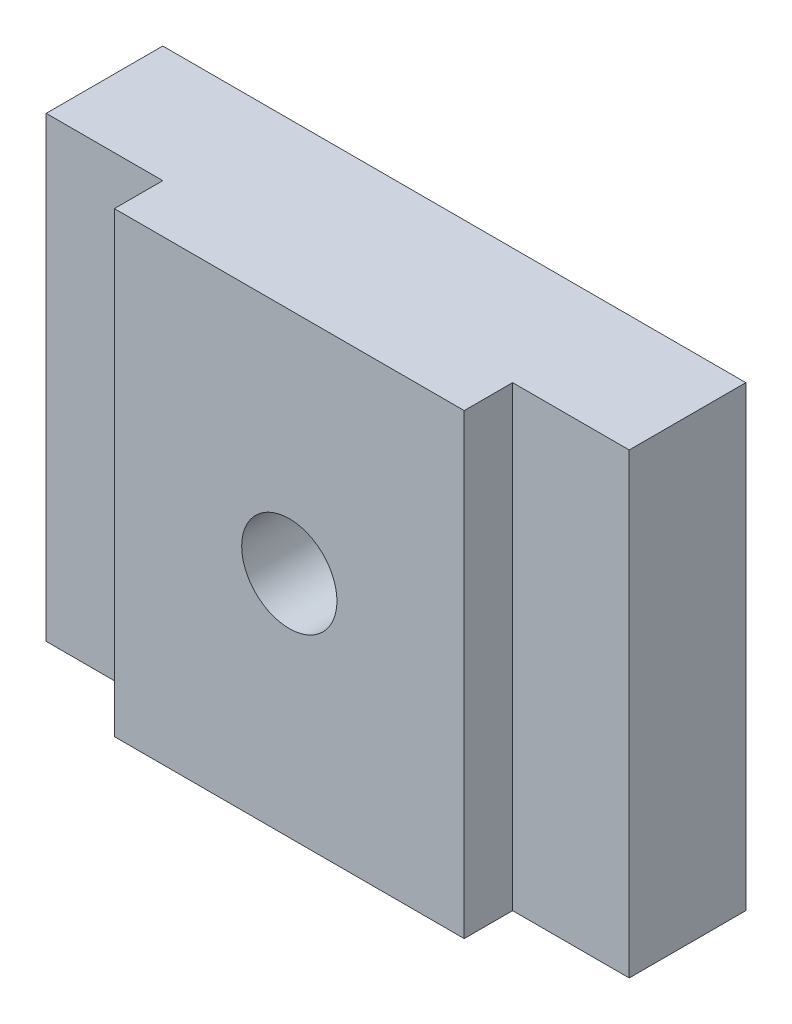
ISO-10303-21;
HEADER;
FILE_DESCRIPTION(('STEP AP214'),'2;1');
FILE_NAME('part.step','',(''),(''),'','','');
FILE_SCHEMA(('AUTOMOTIVE_DESIGN { 1 0 10303 214 1 1 1 1 }'));
ENDSEC;
DATA;
#1=APPLICATION_CONTEXT('core data for automotive mechanical design processes');
#2=APPLICATION_PROTOCOL_DEFINITION('international standard','automotive_design',2000,#1);
#3=PRODUCT_CONTEXT('',#1,'mechanical');
#4=PRODUCT('Part','Part','',(#3));
#5=PRODUCT_RELATED_PRODUCT_CATEGORY('part','',(#4));
#6=PRODUCT_DEFINITION_FORMATION('','',#4);
#7=PRODUCT_DEFINITION_CONTEXT('part definition',#1,'design');
#8=PRODUCT_DEFINITION('design','',#6,#7);
#9=PRODUCT_DEFINITION_SHAPE('','',#8);
#10=(LENGTH_UNIT() NAMED_UNIT(*) SI_UNIT(.MILLI.,.METRE.));
#11=(NAMED_UNIT(*) PLANE_ANGLE_UNIT() SI_UNIT($,.RADIAN.));
#12=(NAMED_UNIT(*) SI_UNIT($,.STERADIAN.) SOLID_ANGLE_UNIT());
#13=UNCERTAINTY_MEASURE_WITH_UNIT(LENGTH_MEASURE(1.E-05),#10,'distance_accuracy_value','');
#14=(GEOMETRIC_REPRESENTATION_CONTEXT(3) GLOBAL_UNCERTAINTY_ASSIGNED_CONTEXT((#13)) GLOBAL_UNIT_ASSIGNED_CONTEXT((#10,
#11,#12)) REPRESENTATION_CONTEXT('',''));
#15=CARTESIAN_POINT('',(0.,0.,0.));
#16=DIRECTION('',(0.,0.,1.));
#17=DIRECTION('',(1.,0.,0.));
#18=AXIS2_PLACEMENT_3D('',#15,#16,#17);
#19=CARTESIAN_POINT('',(-7.65,20.,0.));
#20=DIRECTION('',(1.,0.,0.));
#21=DIRECTION('',(0.,0.,-1.));
#22=AXIS2_PLACEMENT_3D('',#19,#20,#21);
#23=PLANE('',#22);
#24=DIRECTION('',(0.,0.,1.));
#25=VECTOR('',#24,1.);
#26=CARTESIAN_POINT('',(-7.65,0.,0.));
#27=LINE('',#26,#25);
#28=CARTESIAN_POINT('',(-7.65,0.,-2.11666666666666));
#29=VERTEX_POINT('',#28);
#30=CARTESIAN_POINT('',(-7.65,0.,0.));
#31=VERTEX_POINT('',#30);
#32=EDGE_CURVE('E128',#29,#31,#27,.T.);
#33=ORIENTED_EDGE('',*,*,#32,.T.);
#34=DIRECTION('',(0.,-1.,0.));
#35=VECTOR('',#34,1.);
#36=CARTESIAN_POINT('',(-7.65,20.,0.));
#37=LINE('',#36,#35);
#38=CARTESIAN_POINT('',(-7.65,20.,0.));
#39=VERTEX_POINT('',#38);
#40=EDGE_CURVE('E11',#39,#31,#37,.T.);
#41=ORIENTED_EDGE('',*,*,#40,.F.);
#42=DIRECTION('',(0.,0.,1.));
#43=VECTOR('',#42,1.);
#44=CARTESIAN_POINT('',(-7.65,20.,0.));
#45=LINE('',#44,#43);
#46=CARTESIAN_POINT('',(-7.65,20.,-2.11666666666666));
#47=VERTEX_POINT('',#46);
#48=EDGE_CURVE('E143',#47,#39,#45,.T.);
#49=ORIENTED_EDGE('',*,*,#48,.F.);
#50=DIRECTION('',(0.,-1.,0.));
#51=VECTOR('',#50,1.);
#52=CARTESIAN_POINT('',(-7.65,20.,-2.11666666666666));
#53=LINE('',#52,#51);
#54=EDGE_CURVE('E124',#47,#29,#53,.T.);
#55=ORIENTED_EDGE('',*,*,#54,.T.);
#56=EDGE_LOOP('',(#33,#41,#49,#55));
#57=FACE_BOUND('',#56,.T.);
#58=ADVANCED_FACE('F32',(#57),#23,.F.);
#59=CARTESIAN_POINT('',(7.65,20.,0.));
#60=DIRECTION('',(0.,0.,-1.));
#61=DIRECTION('',(-1.,0.,0.));
#62=AXIS2_PLACEMENT_3D('',#59,#60,#61);
#63=PLANE('',#62);
#64=CARTESIAN_POINT('',(0.,10.,0.));
#65=DIRECTION('',(0.,0.,-1.));
#66=DIRECTION('',(-1.,0.,0.));
#67=AXIS2_PLACEMENT_3D('',#64,#65,#66);
#68=CIRCLE('',#67,2.0828);
#69=CARTESIAN_POINT('',(-2.0828,10.,0.));
#70=VERTEX_POINT('',#69);
#71=EDGE_CURVE('E132',#70,#70,#68,.T.);
#72=ORIENTED_EDGE('',*,*,#71,.T.);
#73=EDGE_LOOP('',(#72));
#74=FACE_BOUND('',#73,.T.);
#75=DIRECTION('',(1.,0.,0.));
#76=VECTOR('',#75,1.);
#77=CARTESIAN_POINT('',(7.65,0.,0.));
#78=LINE('',#77,#76);
#79=CARTESIAN_POINT('',(7.65,0.,0.));
#80=VERTEX_POINT('',#79);
#81=EDGE_CURVE('E131',#31,#80,#78,.T.);
#82=ORIENTED_EDGE('',*,*,#81,.T.);
#83=DIRECTION('',(0.,-1.,0.));
#84=VECTOR('',#83,1.);
#85=CARTESIAN_POINT('',(7.65,20.,0.));
#86=LINE('',#85,#84);
#87=CARTESIAN_POINT('',(7.65,20.,0.));
#88=VERTEX_POINT('',#87);
#89=EDGE_CURVE('E40',#88,#80,#86,.T.);
#90=ORIENTED_EDGE('',*,*,#89,.F.);
#91=DIRECTION('',(1.,0.,0.));
#92=VECTOR('',#91,1.);
#93=CARTESIAN_POINT('',(7.65,20.,0.));
#94=LINE('',#93,#92);
#95=EDGE_CURVE('E91',#39,#88,#94,.T.);
#96=ORIENTED_EDGE('',*,*,#95,.F.);
#97=ORIENTED_EDGE('',*,*,#40,.T.);
#98=EDGE_LOOP('',(#82,#90,#96,#97));
#99=FACE_BOUND('',#98,.T.);
#100=ADVANCED_FACE('F182',(#74,#99),#63,.F.);
#101=CARTESIAN_POINT('',(7.65,20.,0.));
#102=DIRECTION('',(-1.,0.,0.));
#103=DIRECTION('',(0.,0.,1.));
#104=AXIS2_PLACEMENT_3D('',#101,#102,#103);
#105=PLANE('',#104);
#106=DIRECTION('',(0.,0.,-1.));
#107=VECTOR('',#106,1.);
#108=CARTESIAN_POINT('',(7.65,0.,0.));
#109=LINE('',#108,#107);
#110=CARTESIAN_POINT('',(7.65,0.,-2.11666666666666));
#111=VERTEX_POINT('',#110);
#112=EDGE_CURVE('E134',#80,#111,#109,.T.);
#113=ORIENTED_EDGE('',*,*,#112,.T.);
#114=DIRECTION('',(0.,-1.,0.));
#115=VECTOR('',#114,1.);
#116=CARTESIAN_POINT('',(7.65,20.,-2.11666666666666));
#117=LINE('',#116,#115);
#118=CARTESIAN_POINT('',(7.65,20.,-2.11666666666666));
#119=VERTEX_POINT('',#118);
#120=EDGE_CURVE('E150',#119,#111,#117,.T.);
#121=ORIENTED_EDGE('',*,*,#120,.F.);
#122=DIRECTION('',(0.,0.,-1.));
#123=VECTOR('',#122,1.);
#124=CARTESIAN_POINT('',(7.65,20.,0.));
#125=LINE('',#124,#123);
#126=EDGE_CURVE('E158',#88,#119,#125,.T.);
#127=ORIENTED_EDGE('',*,*,#126,.F.);
#128=ORIENTED_EDGE('',*,*,#89,.T.);
#129=EDGE_LOOP('',(#113,#121,#127,#128));
#130=FACE_BOUND('',#129,.T.);
#131=ADVANCED_FACE('F156',(#130),#105,.F.);
#132=CARTESIAN_POINT('',(7.65,20.,-2.11666666666666));
#133=DIRECTION('',(0.,0.,-1.));
#134=DIRECTION('',(-1.,0.,0.));
#135=AXIS2_PLACEMENT_3D('',#132,#133,#134);
#136=PLANE('',#135);
#137=DIRECTION('',(1.,0.,0.));
#138=VECTOR('',#137,1.);
#139=CARTESIAN_POINT('',(7.65,0.,-2.11666666666666));
#140=LINE('',#139,#138);
#141=CARTESIAN_POINT('',(12.75,0.,-2.11666666666667));
#142=VERTEX_POINT('',#141);
#143=EDGE_CURVE('E136',#111,#142,#140,.T.);
#144=ORIENTED_EDGE('',*,*,#143,.T.);
#145=DIRECTION('',(0.,-1.,0.));
#146=VECTOR('',#145,1.);
#147=CARTESIAN_POINT('',(12.75,20.,-2.11666666666667));
#148=LINE('',#147,#146);
#149=CARTESIAN_POINT('',(12.75,20.,-2.11666666666667));
#150=VERTEX_POINT('',#149);
#151=EDGE_CURVE('E147',#150,#142,#148,.T.);
#152=ORIENTED_EDGE('',*,*,#151,.F.);
#153=DIRECTION('',(1.,0.,0.));
#154=VECTOR('',#153,1.);
#155=CARTESIAN_POINT('',(7.65,20.,-2.11666666666666));
#156=LINE('',#155,#154);
#157=EDGE_CURVE('E170',#119,#150,#156,.T.);
#158=ORIENTED_EDGE('',*,*,#157,.F.);
#159=ORIENTED_EDGE('',*,*,#120,.T.);
#160=EDGE_LOOP('',(#144,#152,#158,#159));
#161=FACE_BOUND('',#160,.T.);
#162=ADVANCED_FACE('F166',(#161),#136,.F.);
#163=CARTESIAN_POINT('',(12.75,20.,-2.11666666666667));
#164=DIRECTION('',(-1.,0.,0.));
#165=DIRECTION('',(0.,0.,1.));
#166=AXIS2_PLACEMENT_3D('',#163,#164,#165);
#167=PLANE('',#166);
#168=DIRECTION('',(0.,0.,-1.));
#169=VECTOR('',#168,1.);
#170=CARTESIAN_POINT('',(12.75,0.,-2.11666666666667));
#171=LINE('',#170,#169);
#172=CARTESIAN_POINT('',(12.75,0.,-7.21666666666667));
#173=VERTEX_POINT('',#172);
#174=EDGE_CURVE('E138',#142,#173,#171,.T.);
#175=ORIENTED_EDGE('',*,*,#174,.T.);
#176=DIRECTION('',(0.,-1.,0.));
#177=VECTOR('',#176,1.);
#178=CARTESIAN_POINT('',(12.75,20.,-7.21666666666667));
#179=LINE('',#178,#177);
#180=CARTESIAN_POINT('',(12.75,20.,-7.21666666666667));
#181=VERTEX_POINT('',#180);
#182=EDGE_CURVE('E119',#181,#173,#179,.T.);
#183=ORIENTED_EDGE('',*,*,#182,.F.);
#184=DIRECTION('',(0.,0.,-1.));
#185=VECTOR('',#184,1.);
#186=CARTESIAN_POINT('',(12.75,20.,-2.11666666666667));
#187=LINE('',#186,#185);
#188=EDGE_CURVE('E110',#150,#181,#187,.T.);
#189=ORIENTED_EDGE('',*,*,#188,.F.);
#190=ORIENTED_EDGE('',*,*,#151,.T.);
#191=EDGE_LOOP('',(#175,#183,#189,#190));
#192=FACE_BOUND('',#191,.T.);
#193=ADVANCED_FACE('F169',(#192),#167,.F.);
#194=CARTESIAN_POINT('',(-12.75,20.,-7.21666666666667));
#195=DIRECTION('',(0.,0.,1.));
#196=DIRECTION('',(1.,0.,0.));
#197=AXIS2_PLACEMENT_3D('',#194,#195,#196);
#198=PLANE('',#197);
#199=CARTESIAN_POINT('',(0.,10.,-7.21666666666667));
#200=DIRECTION('',(0.,0.,-1.));
#201=DIRECTION('',(-1.,0.,0.));
#202=AXIS2_PLACEMENT_3D('',#199,#200,#201);
#203=CIRCLE('',#202,2.0828);
#204=CARTESIAN_POINT('',(-2.0828,10.,-7.21666666666666));
#205=VERTEX_POINT('',#204);
#206=EDGE_CURVE('E176',#205,#205,#203,.T.);
#207=ORIENTED_EDGE('',*,*,#206,.F.);
#208=EDGE_LOOP('',(#207));
#209=FACE_BOUND('',#208,.T.);
#210=DIRECTION('',(-1.,0.,0.));
#211=VECTOR('',#210,1.);
#212=CARTESIAN_POINT('',(-12.75,0.,-7.21666666666667));
#213=LINE('',#212,#211);
#214=CARTESIAN_POINT('',(-12.75,0.,-7.21666666666667));
#215=VERTEX_POINT('',#214);
#216=EDGE_CURVE('E118',#173,#215,#213,.T.);
#217=ORIENTED_EDGE('',*,*,#216,.T.);
#218=DIRECTION('',(0.,-1.,0.));
#219=VECTOR('',#218,1.);
#220=CARTESIAN_POINT('',(-12.75,20.,-7.21666666666667));
#221=LINE('',#220,#219);
#222=CARTESIAN_POINT('',(-12.75,20.,-7.21666666666667));
#223=VERTEX_POINT('',#222);
#224=EDGE_CURVE('E115',#223,#215,#221,.T.);
#225=ORIENTED_EDGE('',*,*,#224,.F.);
#226=DIRECTION('',(-1.,0.,0.));
#227=VECTOR('',#226,1.);
#228=CARTESIAN_POINT('',(-12.75,20.,-7.21666666666667));
#229=LINE('',#228,#227);
#230=EDGE_CURVE('E104',#181,#223,#229,.T.);
#231=ORIENTED_EDGE('',*,*,#230,.F.);
#232=ORIENTED_EDGE('',*,*,#182,.T.);
#233=EDGE_LOOP('',(#217,#225,#231,#232));
#234=FACE_BOUND('',#233,.T.);
#235=ADVANCED_FACE('F116',(#209,#234),#198,.F.);
#236=CARTESIAN_POINT('',(-12.75,20.,-2.11666666666667));
#237=DIRECTION('',(1.,0.,0.));
#238=DIRECTION('',(0.,0.,-1.));
#239=AXIS2_PLACEMENT_3D('',#236,#237,#238);
#240=PLANE('',#239);
#241=DIRECTION('',(0.,0.,1.));
#242=VECTOR('',#241,1.);
#243=CARTESIAN_POINT('',(-12.75,0.,-2.11666666666667));
#244=LINE('',#243,#242);
#245=CARTESIAN_POINT('',(-12.75,0.,-2.11666666666667));
#246=VERTEX_POINT('',#245);
#247=EDGE_CURVE('E77',#215,#246,#244,.T.);
#248=ORIENTED_EDGE('',*,*,#247,.T.);
#249=DIRECTION('',(0.,-1.,0.));
#250=VECTOR('',#249,1.);
#251=CARTESIAN_POINT('',(-12.75,20.,-2.11666666666667));
#252=LINE('',#251,#250);
#253=CARTESIAN_POINT('',(-12.75,20.,-2.11666666666667));
#254=VERTEX_POINT('',#253);
#255=EDGE_CURVE('E120',#254,#246,#252,.T.);
#256=ORIENTED_EDGE('',*,*,#255,.F.);
#257=DIRECTION('',(0.,0.,1.));
#258=VECTOR('',#257,1.);
#259=CARTESIAN_POINT('',(-12.75,20.,-2.11666666666667));
#260=LINE('',#259,#258);
#261=EDGE_CURVE('E108',#223,#254,#260,.T.);
#262=ORIENTED_EDGE('',*,*,#261,.F.);
#263=ORIENTED_EDGE('',*,*,#224,.T.);
#264=EDGE_LOOP('',(#248,#256,#262,#263));
#265=FACE_BOUND('',#264,.T.);
#266=ADVANCED_FACE('F122',(#265),#240,.F.);
#267=CARTESIAN_POINT('',(-7.65,20.,-2.11666666666666));
#268=DIRECTION('',(0.,0.,-1.));
#269=DIRECTION('',(-1.,0.,0.));
#270=AXIS2_PLACEMENT_3D('',#267,#268,#269);
#271=PLANE('',#270);
#272=DIRECTION('',(1.,0.,0.));
#273=VECTOR('',#272,1.);
#274=CARTESIAN_POINT('',(-7.65,0.,-2.11666666666666));
#275=LINE('',#274,#273);
#276=EDGE_CURVE('E83',#246,#29,#275,.T.);
#277=ORIENTED_EDGE('',*,*,#276,.T.);
#278=ORIENTED_EDGE('',*,*,#54,.F.);
#279=DIRECTION('',(1.,0.,0.));
#280=VECTOR('',#279,1.);
#281=CARTESIAN_POINT('',(-7.65,20.,-2.11666666666666));
#282=LINE('',#281,#280);
#283=EDGE_CURVE('E48',#254,#47,#282,.T.);
#284=ORIENTED_EDGE('',*,*,#283,.F.);
#285=ORIENTED_EDGE('',*,*,#255,.T.);
#286=EDGE_LOOP('',(#277,#278,#284,#285));
#287=FACE_BOUND('',#286,.T.);
#288=ADVANCED_FACE('F196',(#287),#271,.F.);
#289=CARTESIAN_POINT('',(0.,20.,0.));
#290=DIRECTION('',(0.,1.,0.));
#291=DIRECTION('',(0.,0.,1.));
#292=AXIS2_PLACEMENT_3D('',#289,#290,#291);
#293=PLANE('',#292);
#294=ORIENTED_EDGE('',*,*,#48,.T.);
#295=ORIENTED_EDGE('',*,*,#95,.T.);
#296=ORIENTED_EDGE('',*,*,#126,.T.);
#297=ORIENTED_EDGE('',*,*,#157,.T.);
#298=ORIENTED_EDGE('',*,*,#188,.T.);
#299=ORIENTED_EDGE('',*,*,#230,.T.);
#300=ORIENTED_EDGE('',*,*,#261,.T.);
#301=ORIENTED_EDGE('',*,*,#283,.T.);
#302=EDGE_LOOP('',(#294,#295,#296,#297,#298,#299,#300,#301));
#303=FACE_BOUND('',#302,.T.);
#304=ADVANCED_FACE('F106',(#303),#293,.T.);
#305=CARTESIAN_POINT('',(0.,0.,0.));
#306=DIRECTION('',(0.,1.,0.));
#307=DIRECTION('',(0.,0.,1.));
#308=AXIS2_PLACEMENT_3D('',#305,#306,#307);
#309=PLANE('',#308);
#310=ORIENTED_EDGE('',*,*,#32,.F.);
#311=ORIENTED_EDGE('',*,*,#276,.F.);
#312=ORIENTED_EDGE('',*,*,#247,.F.);
#313=ORIENTED_EDGE('',*,*,#216,.F.);
#314=ORIENTED_EDGE('',*,*,#174,.F.);
#315=ORIENTED_EDGE('',*,*,#143,.F.);
#316=ORIENTED_EDGE('',*,*,#112,.F.);
#317=ORIENTED_EDGE('',*,*,#81,.F.);
#318=EDGE_LOOP('',(#310,#311,#312,#313,#314,#315,#316,#317));
#319=FACE_BOUND('',#318,.T.);
#320=ADVANCED_FACE('F162',(#319),#309,.F.);
#321=CARTESIAN_POINT('',(0.,10.,0.));
#322=DIRECTION('',(0.,0.,-1.));
#323=DIRECTION('',(-1.,0.,0.));
#324=AXIS2_PLACEMENT_3D('',#321,#322,#323);
#325=CYLINDRICAL_SURFACE('',#324,2.0828);
#326=CARTESIAN_POINT('',(-2.0828,10.,0.));
#327=CARTESIAN_POINT('',(-2.0828,10.,-0.0751736111111094));
#328=CARTESIAN_POINT('',(-2.0828,10.,-0.15034722222222));
#329=CARTESIAN_POINT('',(-2.0828,10.,-0.300694444444443));
#330=CARTESIAN_POINT('',(-2.0828,10.,-0.375868055555554));
#331=CARTESIAN_POINT('',(-2.0828,10.,-0.526215277777776));
#332=CARTESIAN_POINT('',(-2.0828,10.,-0.601388888888887));
#333=CARTESIAN_POINT('',(-2.0828,10.,-0.751736111111109));
#334=CARTESIAN_POINT('',(-2.0828,10.,-0.82690972222222));
#335=CARTESIAN_POINT('',(-2.0828,10.,-0.977256944444442));
#336=CARTESIAN_POINT('',(-2.0828,10.,-1.05243055555555));
#337=CARTESIAN_POINT('',(-2.0828,10.,-1.20277777777778));
#338=CARTESIAN_POINT('',(-2.0828,10.,-1.27795138888889));
#339=CARTESIAN_POINT('',(-2.0828,10.,-1.42829861111111));
#340=CARTESIAN_POINT('',(-2.0828,10.,-1.50347222222222));
#341=CARTESIAN_POINT('',(-2.0828,10.,-1.65381944444444));
#342=CARTESIAN_POINT('',(-2.0828,10.,-1.72899305555555));
#343=CARTESIAN_POINT('',(-2.0828,10.,-1.87934027777778));
#344=CARTESIAN_POINT('',(-2.0828,10.,-1.95451388888889));
#345=CARTESIAN_POINT('',(-2.0828,10.,-2.10486111111111));
#346=CARTESIAN_POINT('',(-2.0828,10.,-2.18003472222222));
#347=CARTESIAN_POINT('',(-2.0828,10.,-2.33038194444444));
#348=CARTESIAN_POINT('',(-2.0828,10.,-2.40555555555555));
#349=CARTESIAN_POINT('',(-2.0828,10.,-2.55590277777778));
#350=CARTESIAN_POINT('',(-2.0828,10.,-2.63107638888889));
#351=CARTESIAN_POINT('',(-2.0828,10.,-2.78142361111111));
#352=CARTESIAN_POINT('',(-2.0828,10.,-2.85659722222222));
#353=CARTESIAN_POINT('',(-2.0828,10.,-3.00694444444444));
#354=CARTESIAN_POINT('',(-2.0828,10.,-3.08211805555555));
#355=CARTESIAN_POINT('',(-2.0828,10.,-3.23246527777778));
#356=CARTESIAN_POINT('',(-2.0828,10.,-3.30763888888889));
#357=CARTESIAN_POINT('',(-2.0828,10.,-3.45798611111111));
#358=CARTESIAN_POINT('',(-2.0828,10.,-3.53315972222222));
#359=CARTESIAN_POINT('',(-2.0828,10.,-3.68350694444444));
#360=CARTESIAN_POINT('',(-2.0828,10.,-3.75868055555555));
#361=CARTESIAN_POINT('',(-2.0828,10.,-3.90902777777778));
#362=CARTESIAN_POINT('',(-2.0828,10.,-3.98420138888889));
#363=CARTESIAN_POINT('',(-2.0828,10.,-4.13454861111111));
#364=CARTESIAN_POINT('',(-2.0828,10.,-4.20972222222222));
#365=CARTESIAN_POINT('',(-2.0828,10.,-4.36006944444444));
#366=CARTESIAN_POINT('',(-2.0828,10.,-4.43524305555555));
#367=CARTESIAN_POINT('',(-2.0828,10.,-4.58559027777777));
#368=CARTESIAN_POINT('',(-2.0828,10.,-4.66076388888889));
#369=CARTESIAN_POINT('',(-2.0828,10.,-4.81111111111111));
#370=CARTESIAN_POINT('',(-2.0828,10.,-4.88628472222222));
#371=CARTESIAN_POINT('',(-2.0828,10.,-5.03663194444444));
#372=CARTESIAN_POINT('',(-2.0828,10.,-5.11180555555555));
#373=CARTESIAN_POINT('',(-2.0828,10.,-5.26215277777777));
#374=CARTESIAN_POINT('',(-2.0828,10.,-5.33732638888889));
#375=CARTESIAN_POINT('',(-2.0828,10.,-5.48767361111111));
#376=CARTESIAN_POINT('',(-2.0828,10.,-5.56284722222222));
#377=CARTESIAN_POINT('',(-2.0828,10.,-5.71319444444444));
#378=CARTESIAN_POINT('',(-2.0828,10.,-5.78836805555555));
#379=CARTESIAN_POINT('',(-2.0828,10.,-5.93871527777777));
#380=CARTESIAN_POINT('',(-2.0828,10.,-6.01388888888889));
#381=CARTESIAN_POINT('',(-2.0828,10.,-6.16423611111111));
#382=CARTESIAN_POINT('',(-2.0828,10.,-6.23940972222222));
#383=CARTESIAN_POINT('',(-2.0828,10.,-6.38975694444444));
#384=CARTESIAN_POINT('',(-2.0828,10.,-6.46493055555555));
#385=CARTESIAN_POINT('',(-2.0828,10.,-6.61527777777777));
#386=CARTESIAN_POINT('',(-2.0828,10.,-6.69045138888889));
#387=CARTESIAN_POINT('',(-2.0828,10.,-6.84079861111111));
#388=CARTESIAN_POINT('',(-2.0828,10.,-6.91597222222222));
#389=CARTESIAN_POINT('',(-2.0828,10.,-7.06631944444444));
#390=CARTESIAN_POINT('',(-2.0828,10.,-7.14149305555555));
#391=CARTESIAN_POINT('',(-2.0828,10.,-7.21666666666666));
#392=B_SPLINE_CURVE_WITH_KNOTS('',3,(#326,#327,#328,#329,#330,#331,#332,#333,#334,#335,#336,
#337,#338,#339,#340,#341,#342,#343,#344,#345,#346,#347,#348,#349,#350,#351,#352,#353,#354,#355,
#356,#357,#358,#359,#360,#361,#362,#363,#364,#365,#366,#367,#368,#369,#370,#371,#372,#373,#374,
#375,#376,#377,#378,#379,#380,#381,#382,#383,#384,#385,#386,#387,#388,#389,#390,#391),
.UNSPECIFIED.,.F.,.F.,(4,2,2,2,2,2,2,2,2,2,2,2,2,2,2,2,2,2,2,2,2,2,2,2,2,2,2,2,2,2,2,2,4),(0.,
0.225520833333333,0.451041666666667,0.6765625,0.902083333333333,1.12760416666667,1.353125,
1.57864583333333,1.80416666666667,2.0296875,2.25520833333333,2.48072916666667,2.70625,
2.93177083333333,3.15729166666667,3.3828125,3.60833333333333,3.83385416666667,4.059375,
4.28489583333333,4.51041666666667,4.7359375,4.96145833333333,5.18697916666667,5.4125,
5.63802083333333,5.86354166666667,6.0890625,6.31458333333333,6.54010416666667,6.765625,
6.99114583333333,7.21666666666667),.UNSPECIFIED.);
#393=EDGE_CURVE('BSEAM184',#70,#205,#392,.T.);
#394=ORIENTED_EDGE('',*,*,#71,.F.);
#395=ORIENTED_EDGE('',*,*,#206,.T.);
#396=ORIENTED_EDGE('',*,*,#393,.T.);
#397=ORIENTED_EDGE('',*,*,#393,.F.);
#398=EDGE_LOOP('',(#394,#396,#395,#397));
#399=FACE_BOUND('',#398,.T.);
#400=ADVANCED_FACE('F184',(#399),#325,.F.);
#401=CLOSED_SHELL('',(#58,#100,#131,#162,#193,#235,#266,#288,#304,#320,#400));
#402=MANIFOLD_SOLID_BREP('B2',#401);
#403=ADVANCED_BREP_SHAPE_REPRESENTATION('',(#18,#402),#14);
#404=SHAPE_DEFINITION_REPRESENTATION(#9,#403);
ENDSEC;
END-ISO-10303-21;
